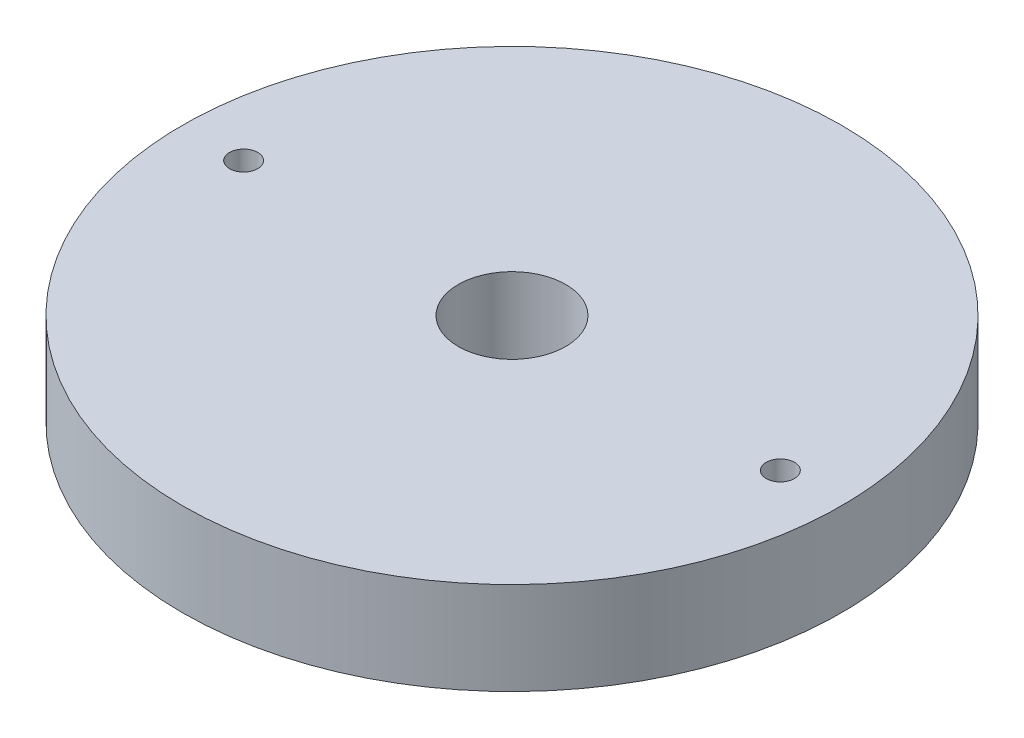
ISO-10303-21;
HEADER;
FILE_DESCRIPTION(('STEP AP214'),'2;1');
FILE_NAME('part.step','',(''),(''),'','','');
FILE_SCHEMA(('AUTOMOTIVE_DESIGN { 1 0 10303 214 1 1 1 1 }'));
ENDSEC;
DATA;
#1=APPLICATION_CONTEXT('core data for automotive mechanical design processes');
#2=APPLICATION_PROTOCOL_DEFINITION('international standard','automotive_design',2000,#1);
#3=PRODUCT_CONTEXT('',#1,'mechanical');
#4=PRODUCT('Part','Part','',(#3));
#5=PRODUCT_RELATED_PRODUCT_CATEGORY('part','',(#4));
#6=PRODUCT_DEFINITION_FORMATION('','',#4);
#7=PRODUCT_DEFINITION_CONTEXT('part definition',#1,'design');
#8=PRODUCT_DEFINITION('design','',#6,#7);
#9=PRODUCT_DEFINITION_SHAPE('','',#8);
#10=(LENGTH_UNIT() NAMED_UNIT(*) SI_UNIT(.MILLI.,.METRE.));
#11=(NAMED_UNIT(*) PLANE_ANGLE_UNIT() SI_UNIT($,.RADIAN.));
#12=(NAMED_UNIT(*) SI_UNIT($,.STERADIAN.) SOLID_ANGLE_UNIT());
#13=UNCERTAINTY_MEASURE_WITH_UNIT(LENGTH_MEASURE(1.E-05),#10,'distance_accuracy_value','');
#14=(GEOMETRIC_REPRESENTATION_CONTEXT(3) GLOBAL_UNCERTAINTY_ASSIGNED_CONTEXT((#13)) GLOBAL_UNIT_ASSIGNED_CONTEXT((#10,
#11,#12)) REPRESENTATION_CONTEXT('',''));
#15=CARTESIAN_POINT('',(0.,0.,0.));
#16=DIRECTION('',(0.,0.,1.));
#17=DIRECTION('',(1.,0.,0.));
#18=AXIS2_PLACEMENT_3D('',#15,#16,#17);
#19=CARTESIAN_POINT('',(0.,5.,0.));
#20=DIRECTION('',(0.,1.,0.));
#21=DIRECTION('',(0.,0.,1.));
#22=AXIS2_PLACEMENT_3D('',#19,#20,#21);
#23=PLANE('',#22);
#24=CARTESIAN_POINT('',(0.,5.,0.));
#25=DIRECTION('',(0.,1.,0.));
#26=DIRECTION('',(0.,0.,1.));
#27=AXIS2_PLACEMENT_3D('',#24,#25,#26);
#28=CIRCLE('',#27,2.89999999999999);
#29=CARTESIAN_POINT('',(0.,5.,2.89999999999999));
#30=VERTEX_POINT('',#29);
#31=EDGE_CURVE('E64',#30,#30,#28,.T.);
#32=ORIENTED_EDGE('',*,*,#31,.F.);
#33=EDGE_LOOP('',(#32));
#34=FACE_BOUND('',#33,.T.);
#35=CARTESIAN_POINT('',(-14.478,5.,0.));
#36=DIRECTION('',(0.,1.,0.));
#37=DIRECTION('',(0.,0.,1.));
#38=AXIS2_PLACEMENT_3D('',#35,#36,#37);
#39=CIRCLE('',#38,0.762000000000001);
#40=CARTESIAN_POINT('',(-14.478,5.,0.761999999999999));
#41=VERTEX_POINT('',#40);
#42=EDGE_CURVE('E42',#41,#41,#39,.T.);
#43=ORIENTED_EDGE('',*,*,#42,.F.);
#44=EDGE_LOOP('',(#43));
#45=FACE_BOUND('',#44,.T.);
#46=CARTESIAN_POINT('',(0.,5.,0.));
#47=DIRECTION('',(0.,1.,0.));
#48=DIRECTION('',(0.,0.,1.));
#49=AXIS2_PLACEMENT_3D('',#46,#47,#48);
#50=CIRCLE('',#49,17.78);
#51=CARTESIAN_POINT('',(0.,5.,17.78));
#52=VERTEX_POINT('',#51);
#53=EDGE_CURVE('E10',#52,#52,#50,.T.);
#54=ORIENTED_EDGE('',*,*,#53,.T.);
#55=EDGE_LOOP('',(#54));
#56=FACE_BOUND('',#55,.T.);
#57=CARTESIAN_POINT('',(14.478,5.,0.));
#58=DIRECTION('',(0.,1.,0.));
#59=DIRECTION('',(0.,0.,1.));
#60=AXIS2_PLACEMENT_3D('',#57,#58,#59);
#61=CIRCLE('',#60,0.762000000000001);
#62=CARTESIAN_POINT('',(14.478,5.,0.762000000000001));
#63=VERTEX_POINT('',#62);
#64=EDGE_CURVE('E47',#63,#63,#61,.T.);
#65=ORIENTED_EDGE('',*,*,#64,.F.);
#66=EDGE_LOOP('',(#65));
#67=FACE_BOUND('',#66,.T.);
#68=ADVANCED_FACE('F31',(#34,#45,#56,#67),#23,.T.);
#69=CARTESIAN_POINT('',(0.,0.,0.));
#70=DIRECTION('',(0.,1.,0.));
#71=DIRECTION('',(0.,0.,1.));
#72=AXIS2_PLACEMENT_3D('',#69,#70,#71);
#73=PLANE('',#72);
#74=CARTESIAN_POINT('',(0.,0.,0.));
#75=DIRECTION('',(0.,1.,0.));
#76=DIRECTION('',(0.,0.,1.));
#77=AXIS2_PLACEMENT_3D('',#74,#75,#76);
#78=CIRCLE('',#77,2.9);
#79=CARTESIAN_POINT('',(0.,0.,2.9));
#80=VERTEX_POINT('',#79);
#81=EDGE_CURVE('E59',#80,#80,#78,.T.);
#82=ORIENTED_EDGE('',*,*,#81,.T.);
#83=EDGE_LOOP('',(#82));
#84=FACE_BOUND('',#83,.T.);
#85=CARTESIAN_POINT('',(0.,0.,13.97));
#86=DIRECTION('',(0.,-1.,0.));
#87=DIRECTION('',(0.,0.,-1.));
#88=AXIS2_PLACEMENT_3D('',#85,#86,#87);
#89=CIRCLE('',#88,2.667);
#90=CARTESIAN_POINT('',(0.,0.,11.303));
#91=VERTEX_POINT('',#90);
#92=EDGE_CURVE('E56',#91,#91,#89,.T.);
#93=ORIENTED_EDGE('',*,*,#92,.F.);
#94=EDGE_LOOP('',(#93));
#95=FACE_BOUND('',#94,.T.);
#96=CARTESIAN_POINT('',(0.,0.,0.));
#97=DIRECTION('',(0.,1.,0.));
#98=DIRECTION('',(0.,0.,1.));
#99=AXIS2_PLACEMENT_3D('',#96,#97,#98);
#100=CIRCLE('',#99,17.78);
#101=CARTESIAN_POINT('',(0.,0.,17.78));
#102=VERTEX_POINT('',#101);
#103=EDGE_CURVE('E35',#102,#102,#100,.T.);
#104=ORIENTED_EDGE('',*,*,#103,.F.);
#105=EDGE_LOOP('',(#104));
#106=FACE_BOUND('',#105,.T.);
#107=CARTESIAN_POINT('',(-14.478,0.,0.));
#108=DIRECTION('',(0.,1.,0.));
#109=DIRECTION('',(0.,0.,1.));
#110=AXIS2_PLACEMENT_3D('',#107,#108,#109);
#111=CIRCLE('',#110,0.762000000000001);
#112=CARTESIAN_POINT('',(-14.478,0.,0.761999999999999));
#113=VERTEX_POINT('',#112);
#114=EDGE_CURVE('E44',#113,#113,#111,.T.);
#115=ORIENTED_EDGE('',*,*,#114,.T.);
#116=EDGE_LOOP('',(#115));
#117=FACE_BOUND('',#116,.T.);
#118=CARTESIAN_POINT('',(14.478,0.,0.));
#119=DIRECTION('',(0.,1.,0.));
#120=DIRECTION('',(0.,0.,1.));
#121=AXIS2_PLACEMENT_3D('',#118,#119,#120);
#122=CIRCLE('',#121,0.762000000000001);
#123=CARTESIAN_POINT('',(14.478,0.,0.762000000000001));
#124=VERTEX_POINT('',#123);
#125=EDGE_CURVE('E50',#124,#124,#122,.T.);
#126=ORIENTED_EDGE('',*,*,#125,.T.);
#127=EDGE_LOOP('',(#126));
#128=FACE_BOUND('',#127,.T.);
#129=ADVANCED_FACE('F72',(#84,#95,#106,#117,#128),#73,.F.);
#130=CARTESIAN_POINT('',(0.,5.,0.));
#131=DIRECTION('',(0.,-1.,0.));
#132=DIRECTION('',(0.,0.,-1.));
#133=AXIS2_PLACEMENT_3D('',#130,#131,#132);
#134=CYLINDRICAL_SURFACE('',#133,17.78);
#135=ORIENTED_EDGE('',*,*,#53,.F.);
#136=EDGE_LOOP('',(#135));
#137=FACE_BOUND('',#136,.T.);
#138=ORIENTED_EDGE('',*,*,#103,.T.);
#139=EDGE_LOOP('',(#138));
#140=FACE_BOUND('',#139,.T.);
#141=ADVANCED_FACE('F33',(#137,#140),#134,.T.);
#142=CARTESIAN_POINT('',(-14.478,5.,0.));
#143=DIRECTION('',(0.,-1.,0.));
#144=DIRECTION('',(0.,0.,-1.));
#145=AXIS2_PLACEMENT_3D('',#142,#143,#144);
#146=CYLINDRICAL_SURFACE('',#145,0.762000000000001);
#147=ORIENTED_EDGE('',*,*,#42,.T.);
#148=EDGE_LOOP('',(#147));
#149=FACE_BOUND('',#148,.T.);
#150=ORIENTED_EDGE('',*,*,#114,.F.);
#151=EDGE_LOOP('',(#150));
#152=FACE_BOUND('',#151,.T.);
#153=ADVANCED_FACE('F82',(#149,#152),#146,.F.);
#154=CARTESIAN_POINT('',(14.478,5.,0.));
#155=DIRECTION('',(0.,-1.,0.));
#156=DIRECTION('',(0.,0.,-1.));
#157=AXIS2_PLACEMENT_3D('',#154,#155,#156);
#158=CYLINDRICAL_SURFACE('',#157,0.762000000000001);
#159=ORIENTED_EDGE('',*,*,#64,.T.);
#160=EDGE_LOOP('',(#159));
#161=FACE_BOUND('',#160,.T.);
#162=ORIENTED_EDGE('',*,*,#125,.F.);
#163=EDGE_LOOP('',(#162));
#164=FACE_BOUND('',#163,.T.);
#165=ADVANCED_FACE('F78',(#161,#164),#158,.F.);
#166=CARTESIAN_POINT('',(0.,3.,13.97));
#167=DIRECTION('',(0.,-1.,0.));
#168=DIRECTION('',(0.,0.,-1.));
#169=AXIS2_PLACEMENT_3D('',#166,#167,#168);
#170=CYLINDRICAL_SURFACE('',#169,2.667);
#171=CARTESIAN_POINT('',(0.,3.,13.97));
#172=DIRECTION('',(0.,-1.,0.));
#173=DIRECTION('',(0.,0.,-1.));
#174=AXIS2_PLACEMENT_3D('',#171,#172,#173);
#175=CIRCLE('',#174,2.667);
#176=CARTESIAN_POINT('',(0.,3.,11.303));
#177=VERTEX_POINT('',#176);
#178=EDGE_CURVE('E53',#177,#177,#175,.T.);
#179=ORIENTED_EDGE('',*,*,#178,.F.);
#180=EDGE_LOOP('',(#179));
#181=FACE_BOUND('',#180,.T.);
#182=ORIENTED_EDGE('',*,*,#92,.T.);
#183=EDGE_LOOP('',(#182));
#184=FACE_BOUND('',#183,.T.);
#185=ADVANCED_FACE('F81',(#181,#184),#170,.F.);
#186=CARTESIAN_POINT('',(0.,3.,13.97));
#187=DIRECTION('',(0.,-1.,0.));
#188=DIRECTION('',(0.,0.,-1.));
#189=AXIS2_PLACEMENT_3D('',#186,#187,#188);
#190=PLANE('',#189);
#191=ORIENTED_EDGE('',*,*,#178,.T.);
#192=EDGE_LOOP('',(#191));
#193=FACE_BOUND('',#192,.T.);
#194=ADVANCED_FACE('F99',(#193),#190,.T.);
#195=CARTESIAN_POINT('',(0.,5.,0.));
#196=DIRECTION('',(0.,1.,0.));
#197=DIRECTION('',(0.,0.,1.));
#198=AXIS2_PLACEMENT_3D('',#195,#196,#197);
#199=CYLINDRICAL_SURFACE('',#198,2.89999999999999);
#200=ORIENTED_EDGE('',*,*,#81,.F.);
#201=EDGE_LOOP('',(#200));
#202=FACE_BOUND('',#201,.T.);
#203=ORIENTED_EDGE('',*,*,#31,.T.);
#204=EDGE_LOOP('',(#203));
#205=FACE_BOUND('',#204,.T.);
#206=ADVANCED_FACE('F68',(#202,#205),#199,.F.);
#207=CLOSED_SHELL('',(#68,#129,#141,#153,#165,#185,#194,#206));
#208=MANIFOLD_SOLID_BREP('B2',#207);
#209=ADVANCED_BREP_SHAPE_REPRESENTATION('',(#18,#208),#14);
#210=SHAPE_DEFINITION_REPRESENTATION(#9,#209);
ENDSEC;
END-ISO-10303-21;
